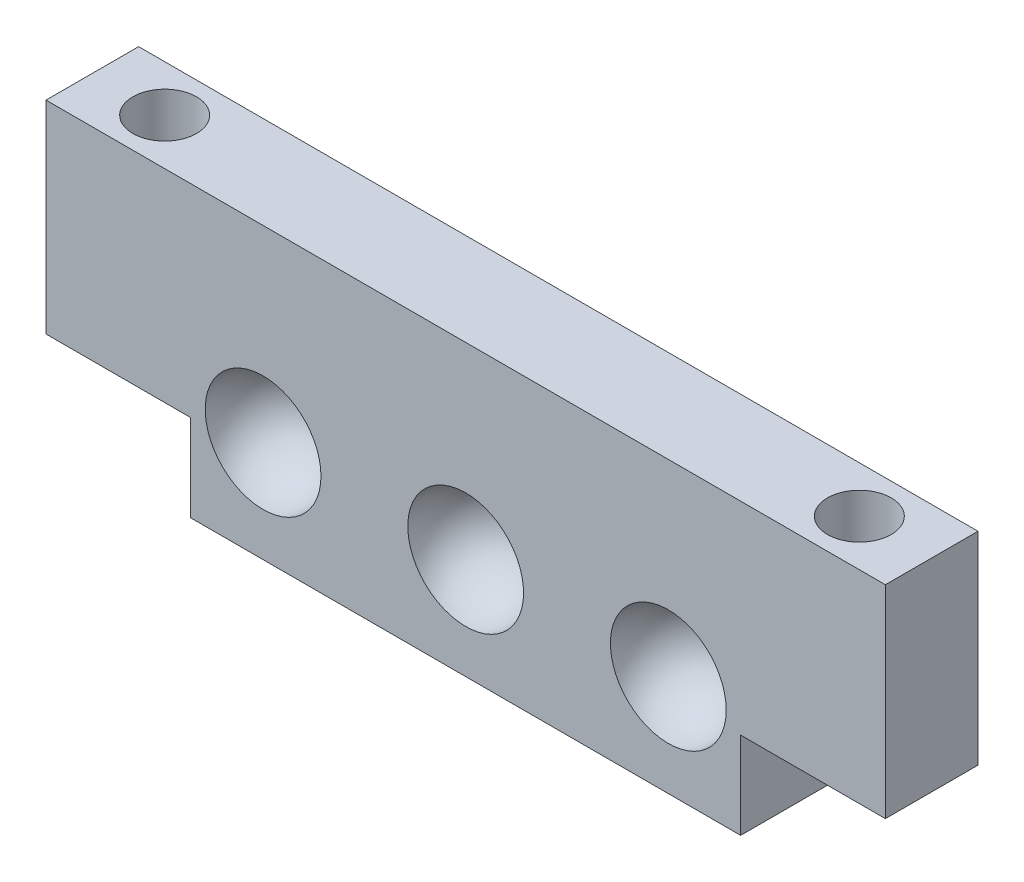
ISO-10303-21;
HEADER;
FILE_DESCRIPTION(('STEP AP214'),'2;1');
FILE_NAME('part.step','',(''),(''),'','','');
FILE_SCHEMA(('AUTOMOTIVE_DESIGN { 1 0 10303 214 1 1 1 1 }'));
ENDSEC;
DATA;
#1=APPLICATION_CONTEXT('core data for automotive mechanical design processes');
#2=APPLICATION_PROTOCOL_DEFINITION('international standard','automotive_design',2000,#1);
#3=PRODUCT_CONTEXT('',#1,'mechanical');
#4=PRODUCT('Part','Part','',(#3));
#5=PRODUCT_RELATED_PRODUCT_CATEGORY('part','',(#4));
#6=PRODUCT_DEFINITION_FORMATION('','',#4);
#7=PRODUCT_DEFINITION_CONTEXT('part definition',#1,'design');
#8=PRODUCT_DEFINITION('design','',#6,#7);
#9=PRODUCT_DEFINITION_SHAPE('','',#8);
#10=(LENGTH_UNIT() NAMED_UNIT(*) SI_UNIT(.MILLI.,.METRE.));
#11=(NAMED_UNIT(*) PLANE_ANGLE_UNIT() SI_UNIT($,.RADIAN.));
#12=(NAMED_UNIT(*) SI_UNIT($,.STERADIAN.) SOLID_ANGLE_UNIT());
#13=UNCERTAINTY_MEASURE_WITH_UNIT(LENGTH_MEASURE(1.E-05),#10,'distance_accuracy_value','');
#14=(GEOMETRIC_REPRESENTATION_CONTEXT(3) GLOBAL_UNCERTAINTY_ASSIGNED_CONTEXT((#13)) GLOBAL_UNIT_ASSIGNED_CONTEXT((#10,
#11,#12)) REPRESENTATION_CONTEXT('',''));
#15=CARTESIAN_POINT('',(0.,0.,0.));
#16=DIRECTION('',(0.,0.,1.));
#17=DIRECTION('',(1.,0.,0.));
#18=AXIS2_PLACEMENT_3D('',#15,#16,#17);
#19=CARTESIAN_POINT('',(132.5,57.7665613260769,-8.));
#20=DIRECTION('',(0.,-1.,0.));
#21=DIRECTION('',(0.,0.,-1.));
#22=AXIS2_PLACEMENT_3D('',#19,#20,#21);
#23=CYLINDRICAL_SURFACE('',#22,5.5);
#24=CARTESIAN_POINT('',(132.5,0.,-8.));
#25=DIRECTION('',(0.,1.,0.));
#26=DIRECTION('',(0.,0.,-1.));
#27=AXIS2_PLACEMENT_3D('',#24,#25,#26);
#28=CIRCLE('',#27,5.5);
#29=CARTESIAN_POINT('',(132.5,0.,-13.5));
#30=VERTEX_POINT('',#29);
#31=EDGE_CURVE('E117',#30,#30,#28,.T.);
#32=ORIENTED_EDGE('',*,*,#31,.F.);
#33=EDGE_LOOP('',(#32));
#34=FACE_BOUND('',#33,.T.);
#35=CARTESIAN_POINT('',(132.5,35.,-8.));
#36=DIRECTION('',(0.,-1.,0.));
#37=DIRECTION('',(-1.,0.,0.));
#38=AXIS2_PLACEMENT_3D('',#35,#36,#37);
#39=CIRCLE('',#38,5.5);
#40=CARTESIAN_POINT('',(127.,35.,-8.));
#41=VERTEX_POINT('',#40);
#42=EDGE_CURVE('E163',#41,#41,#39,.T.);
#43=ORIENTED_EDGE('',*,*,#42,.F.);
#44=EDGE_LOOP('',(#43));
#45=FACE_BOUND('',#44,.T.);
#46=ADVANCED_FACE('F17',(#34,#45),#23,.F.);
#47=CARTESIAN_POINT('',(12.5,57.7665613260769,-8.));
#48=DIRECTION('',(0.,-1.,0.));
#49=DIRECTION('',(0.,0.,-1.));
#50=AXIS2_PLACEMENT_3D('',#47,#48,#49);
#51=CYLINDRICAL_SURFACE('',#50,5.5);
#52=CARTESIAN_POINT('',(12.5,0.,-8.));
#53=DIRECTION('',(0.,1.,0.));
#54=DIRECTION('',(0.,0.,-1.));
#55=AXIS2_PLACEMENT_3D('',#52,#53,#54);
#56=CIRCLE('',#55,5.5);
#57=CARTESIAN_POINT('',(12.5,0.,-13.5));
#58=VERTEX_POINT('',#57);
#59=EDGE_CURVE('E178',#58,#58,#56,.T.);
#60=ORIENTED_EDGE('',*,*,#59,.F.);
#61=EDGE_LOOP('',(#60));
#62=FACE_BOUND('',#61,.T.);
#63=CARTESIAN_POINT('',(12.5,35.,-8.));
#64=DIRECTION('',(0.,-1.,0.));
#65=DIRECTION('',(-1.,0.,0.));
#66=AXIS2_PLACEMENT_3D('',#63,#64,#65);
#67=CIRCLE('',#66,5.5);
#68=CARTESIAN_POINT('',(7.,35.,-8.));
#69=VERTEX_POINT('',#68);
#70=EDGE_CURVE('E158',#69,#69,#67,.T.);
#71=ORIENTED_EDGE('',*,*,#70,.F.);
#72=EDGE_LOOP('',(#71));
#73=FACE_BOUND('',#72,.T.);
#74=ADVANCED_FACE('F281',(#62,#73),#51,.F.);
#75=CARTESIAN_POINT('',(107.5,2.5,0.));
#76=DIRECTION('',(1.,0.,0.));
#77=DIRECTION('',(0.,1.,0.));
#78=AXIS2_PLACEMENT_3D('',#75,#76,#77);
#79=SPHERICAL_SURFACE('',#78,10.);
#80=CARTESIAN_POINT('',(107.5,2.5,0.));
#81=DIRECTION('',(0.,0.,1.));
#82=DIRECTION('',(1.,0.,0.));
#83=AXIS2_PLACEMENT_3D('',#80,#81,#82);
#84=SPHERICAL_SURFACE('',#83,10.);
#85=CARTESIAN_POINT('',(107.5,2.5,0.));
#86=DIRECTION('',(0.,0.,1.));
#87=DIRECTION('',(1.,0.,0.));
#88=AXIS2_PLACEMENT_3D('',#85,#86,#87);
#89=CIRCLE('',#88,10.);
#90=CARTESIAN_POINT('',(117.5,2.5,0.));
#91=VERTEX_POINT('',#90);
#92=EDGE_CURVE('E75',#91,#91,#89,.T.);
#93=ORIENTED_EDGE('',*,*,#92,.T.);
#94=EDGE_LOOP('',(#93));
#95=FACE_BOUND('',#94,.T.);
#96=ADVANCED_FACE('F76',(#95),#84,.F.);
#97=CARTESIAN_POINT('',(72.5,2.5,0.));
#98=DIRECTION('',(1.,0.,0.));
#99=DIRECTION('',(0.,1.,0.));
#100=AXIS2_PLACEMENT_3D('',#97,#98,#99);
#101=SPHERICAL_SURFACE('',#100,10.);
#102=CARTESIAN_POINT('',(72.5,2.5,0.));
#103=DIRECTION('',(0.,0.,1.));
#104=DIRECTION('',(1.,0.,0.));
#105=AXIS2_PLACEMENT_3D('',#102,#103,#104);
#106=SPHERICAL_SURFACE('',#105,10.);
#107=CARTESIAN_POINT('',(72.5,2.5,0.));
#108=DIRECTION('',(0.,0.,1.));
#109=DIRECTION('',(1.,0.,0.));
#110=AXIS2_PLACEMENT_3D('',#107,#108,#109);
#111=CIRCLE('',#110,10.);
#112=CARTESIAN_POINT('',(82.5,2.5,0.));
#113=VERTEX_POINT('',#112);
#114=EDGE_CURVE('E26',#113,#113,#111,.T.);
#115=ORIENTED_EDGE('',*,*,#114,.T.);
#116=EDGE_LOOP('',(#115));
#117=FACE_BOUND('',#116,.T.);
#118=ADVANCED_FACE('F292',(#117),#106,.F.);
#119=CARTESIAN_POINT('',(37.5,2.5,0.));
#120=DIRECTION('',(1.,0.,0.));
#121=DIRECTION('',(0.,1.,0.));
#122=AXIS2_PLACEMENT_3D('',#119,#120,#121);
#123=SPHERICAL_SURFACE('',#122,10.);
#124=CARTESIAN_POINT('',(37.5,2.5,0.));
#125=DIRECTION('',(0.,0.,1.));
#126=DIRECTION('',(1.,0.,0.));
#127=AXIS2_PLACEMENT_3D('',#124,#125,#126);
#128=SPHERICAL_SURFACE('',#127,10.);
#129=CARTESIAN_POINT('',(37.5,2.5,0.));
#130=DIRECTION('',(0.,0.,1.));
#131=DIRECTION('',(1.,0.,0.));
#132=AXIS2_PLACEMENT_3D('',#129,#130,#131);
#133=CIRCLE('',#132,10.);
#134=CARTESIAN_POINT('',(47.5,2.5,0.));
#135=VERTEX_POINT('',#134);
#136=EDGE_CURVE('E11',#135,#135,#133,.T.);
#137=ORIENTED_EDGE('',*,*,#136,.T.);
#138=EDGE_LOOP('',(#137));
#139=FACE_BOUND('',#138,.T.);
#140=ADVANCED_FACE('F301',(#139),#128,.F.);
#141=CARTESIAN_POINT('',(0.,0.,0.));
#142=DIRECTION('',(0.,0.,1.));
#143=DIRECTION('',(1.,0.,0.));
#144=AXIS2_PLACEMENT_3D('',#141,#142,#143);
#145=PLANE('',#144);
#146=DIRECTION('',(0.,1.,0.));
#147=VECTOR('',#146,1.);
#148=CARTESIAN_POINT('',(145.,0.,0.));
#149=LINE('',#148,#147);
#150=CARTESIAN_POINT('',(145.,0.,0.));
#151=VERTEX_POINT('',#150);
#152=CARTESIAN_POINT('',(145.,35.,0.));
#153=VERTEX_POINT('',#152);
#154=EDGE_CURVE('E132',#151,#153,#149,.T.);
#155=ORIENTED_EDGE('',*,*,#154,.T.);
#156=DIRECTION('',(-1.,0.,0.));
#157=VECTOR('',#156,1.);
#158=CARTESIAN_POINT('',(145.,35.,0.));
#159=LINE('',#158,#157);
#160=CARTESIAN_POINT('',(0.,35.,0.));
#161=VERTEX_POINT('',#160);
#162=EDGE_CURVE('E162',#153,#161,#159,.T.);
#163=ORIENTED_EDGE('',*,*,#162,.T.);
#164=DIRECTION('',(0.,-1.,0.));
#165=VECTOR('',#164,1.);
#166=CARTESIAN_POINT('',(0.,35.,0.));
#167=LINE('',#166,#165);
#168=CARTESIAN_POINT('',(0.,0.,0.));
#169=VERTEX_POINT('',#168);
#170=EDGE_CURVE('E166',#161,#169,#167,.T.);
#171=ORIENTED_EDGE('',*,*,#170,.T.);
#172=DIRECTION('',(1.,0.,0.));
#173=VECTOR('',#172,1.);
#174=CARTESIAN_POINT('',(0.,0.,0.));
#175=LINE('',#174,#173);
#176=CARTESIAN_POINT('',(25.,0.,0.));
#177=VERTEX_POINT('',#176);
#178=EDGE_CURVE('E181',#169,#177,#175,.T.);
#179=ORIENTED_EDGE('',*,*,#178,.T.);
#180=DIRECTION('',(0.,-1.,0.));
#181=VECTOR('',#180,1.);
#182=CARTESIAN_POINT('',(25.,0.,0.));
#183=LINE('',#182,#181);
#184=CARTESIAN_POINT('',(25.,-15.,0.));
#185=VERTEX_POINT('',#184);
#186=EDGE_CURVE('E201',#177,#185,#183,.T.);
#187=ORIENTED_EDGE('',*,*,#186,.T.);
#188=DIRECTION('',(1.,0.,0.));
#189=VECTOR('',#188,1.);
#190=CARTESIAN_POINT('',(25.,-15.,0.));
#191=LINE('',#190,#189);
#192=CARTESIAN_POINT('',(120.,-15.,0.));
#193=VERTEX_POINT('',#192);
#194=EDGE_CURVE('E97',#185,#193,#191,.T.);
#195=ORIENTED_EDGE('',*,*,#194,.T.);
#196=DIRECTION('',(0.,1.,0.));
#197=VECTOR('',#196,1.);
#198=CARTESIAN_POINT('',(120.,-15.,0.));
#199=LINE('',#198,#197);
#200=CARTESIAN_POINT('',(120.,0.,0.));
#201=VERTEX_POINT('',#200);
#202=EDGE_CURVE('E105',#193,#201,#199,.T.);
#203=ORIENTED_EDGE('',*,*,#202,.T.);
#204=DIRECTION('',(1.,0.,0.));
#205=VECTOR('',#204,1.);
#206=CARTESIAN_POINT('',(120.,0.,0.));
#207=LINE('',#206,#205);
#208=EDGE_CURVE('E86',#201,#151,#207,.T.);
#209=ORIENTED_EDGE('',*,*,#208,.T.);
#210=EDGE_LOOP('',(#155,#163,#171,#179,#187,#195,#203,#209));
#211=FACE_BOUND('',#210,.T.);
#212=ORIENTED_EDGE('',*,*,#136,.F.);
#213=EDGE_LOOP('',(#212));
#214=FACE_BOUND('',#213,.T.);
#215=ORIENTED_EDGE('',*,*,#114,.F.);
#216=EDGE_LOOP('',(#215));
#217=FACE_BOUND('',#216,.T.);
#218=ORIENTED_EDGE('',*,*,#92,.F.);
#219=EDGE_LOOP('',(#218));
#220=FACE_BOUND('',#219,.T.);
#221=ADVANCED_FACE('F127',(#211,#214,#217,#220),#145,.T.);
#222=CARTESIAN_POINT('',(0.,0.,-16.));
#223=DIRECTION('',(0.,0.,1.));
#224=DIRECTION('',(1.,0.,0.));
#225=AXIS2_PLACEMENT_3D('',#222,#223,#224);
#226=PLANE('',#225);
#227=DIRECTION('',(0.,1.,0.));
#228=VECTOR('',#227,1.);
#229=CARTESIAN_POINT('',(145.,0.,-16.));
#230=LINE('',#229,#228);
#231=CARTESIAN_POINT('',(145.,0.,-16.));
#232=VERTEX_POINT('',#231);
#233=CARTESIAN_POINT('',(145.,35.,-16.));
#234=VERTEX_POINT('',#233);
#235=EDGE_CURVE('E148',#232,#234,#230,.T.);
#236=ORIENTED_EDGE('',*,*,#235,.F.);
#237=DIRECTION('',(1.,0.,0.));
#238=VECTOR('',#237,1.);
#239=CARTESIAN_POINT('',(120.,0.,-16.));
#240=LINE('',#239,#238);
#241=CARTESIAN_POINT('',(120.,0.,-16.));
#242=VERTEX_POINT('',#241);
#243=EDGE_CURVE('E79',#242,#232,#240,.T.);
#244=ORIENTED_EDGE('',*,*,#243,.F.);
#245=DIRECTION('',(0.,1.,0.));
#246=VECTOR('',#245,1.);
#247=CARTESIAN_POINT('',(120.,-15.,-16.));
#248=LINE('',#247,#246);
#249=CARTESIAN_POINT('',(120.,-15.,-16.));
#250=VERTEX_POINT('',#249);
#251=EDGE_CURVE('E109',#250,#242,#248,.T.);
#252=ORIENTED_EDGE('',*,*,#251,.F.);
#253=DIRECTION('',(1.,0.,0.));
#254=VECTOR('',#253,1.);
#255=CARTESIAN_POINT('',(25.,-15.,-16.));
#256=LINE('',#255,#254);
#257=CARTESIAN_POINT('',(25.,-15.,-16.));
#258=VERTEX_POINT('',#257);
#259=EDGE_CURVE('E92',#258,#250,#256,.T.);
#260=ORIENTED_EDGE('',*,*,#259,.F.);
#261=DIRECTION('',(0.,-1.,0.));
#262=VECTOR('',#261,1.);
#263=CARTESIAN_POINT('',(25.,0.,-16.));
#264=LINE('',#263,#262);
#265=CARTESIAN_POINT('',(25.,0.,-16.));
#266=VERTEX_POINT('',#265);
#267=EDGE_CURVE('E90',#266,#258,#264,.T.);
#268=ORIENTED_EDGE('',*,*,#267,.F.);
#269=DIRECTION('',(1.,0.,0.));
#270=VECTOR('',#269,1.);
#271=CARTESIAN_POINT('',(0.,0.,-16.));
#272=LINE('',#271,#270);
#273=CARTESIAN_POINT('',(0.,0.,-16.));
#274=VERTEX_POINT('',#273);
#275=EDGE_CURVE('E202',#274,#266,#272,.T.);
#276=ORIENTED_EDGE('',*,*,#275,.F.);
#277=DIRECTION('',(0.,-1.,0.));
#278=VECTOR('',#277,1.);
#279=CARTESIAN_POINT('',(0.,35.,-16.));
#280=LINE('',#279,#278);
#281=CARTESIAN_POINT('',(0.,35.,-16.));
#282=VERTEX_POINT('',#281);
#283=EDGE_CURVE('E170',#282,#274,#280,.T.);
#284=ORIENTED_EDGE('',*,*,#283,.F.);
#285=DIRECTION('',(-1.,0.,0.));
#286=VECTOR('',#285,1.);
#287=CARTESIAN_POINT('',(145.,35.,-16.));
#288=LINE('',#287,#286);
#289=EDGE_CURVE('E174',#234,#282,#288,.T.);
#290=ORIENTED_EDGE('',*,*,#289,.F.);
#291=EDGE_LOOP('',(#236,#244,#252,#260,#268,#276,#284,#290));
#292=FACE_BOUND('',#291,.T.);
#293=ADVANCED_FACE('F227',(#292),#226,.F.);
#294=CARTESIAN_POINT('',(120.,0.,-16.));
#295=DIRECTION('',(0.,-1.,0.));
#296=DIRECTION('',(0.,0.,-1.));
#297=AXIS2_PLACEMENT_3D('',#294,#295,#296);
#298=PLANE('',#297);
#299=ORIENTED_EDGE('',*,*,#208,.F.);
#300=DIRECTION('',(0.,0.,1.));
#301=VECTOR('',#300,1.);
#302=CARTESIAN_POINT('',(120.,0.,-16.));
#303=LINE('',#302,#301);
#304=EDGE_CURVE('E113',#242,#201,#303,.T.);
#305=ORIENTED_EDGE('',*,*,#304,.F.);
#306=ORIENTED_EDGE('',*,*,#243,.T.);
#307=DIRECTION('',(0.,0.,1.));
#308=VECTOR('',#307,1.);
#309=CARTESIAN_POINT('',(145.,0.,-16.));
#310=LINE('',#309,#308);
#311=EDGE_CURVE('E140',#232,#151,#310,.T.);
#312=ORIENTED_EDGE('',*,*,#311,.T.);
#313=EDGE_LOOP('',(#299,#305,#306,#312));
#314=FACE_BOUND('',#313,.T.);
#315=ORIENTED_EDGE('',*,*,#31,.T.);
#316=EDGE_LOOP('',(#315));
#317=FACE_BOUND('',#316,.T.);
#318=ADVANCED_FACE('F141',(#314,#317),#298,.T.);
#319=CARTESIAN_POINT('',(120.,-15.,-16.));
#320=DIRECTION('',(1.,0.,0.));
#321=DIRECTION('',(0.,1.,0.));
#322=AXIS2_PLACEMENT_3D('',#319,#320,#321);
#323=PLANE('',#322);
#324=ORIENTED_EDGE('',*,*,#202,.F.);
#325=DIRECTION('',(0.,0.,1.));
#326=VECTOR('',#325,1.);
#327=CARTESIAN_POINT('',(120.,-15.,-16.));
#328=LINE('',#327,#326);
#329=EDGE_CURVE('E96',#250,#193,#328,.T.);
#330=ORIENTED_EDGE('',*,*,#329,.F.);
#331=ORIENTED_EDGE('',*,*,#251,.T.);
#332=ORIENTED_EDGE('',*,*,#304,.T.);
#333=EDGE_LOOP('',(#324,#330,#331,#332));
#334=FACE_BOUND('',#333,.T.);
#335=ADVANCED_FACE('F266',(#334),#323,.T.);
#336=CARTESIAN_POINT('',(25.,-15.,-16.));
#337=DIRECTION('',(0.,-1.,0.));
#338=DIRECTION('',(0.,0.,-1.));
#339=AXIS2_PLACEMENT_3D('',#336,#337,#338);
#340=PLANE('',#339);
#341=ORIENTED_EDGE('',*,*,#194,.F.);
#342=DIRECTION('',(0.,0.,1.));
#343=VECTOR('',#342,1.);
#344=CARTESIAN_POINT('',(25.,-15.,-16.));
#345=LINE('',#344,#343);
#346=EDGE_CURVE('E98',#258,#185,#345,.T.);
#347=ORIENTED_EDGE('',*,*,#346,.F.);
#348=ORIENTED_EDGE('',*,*,#259,.T.);
#349=ORIENTED_EDGE('',*,*,#329,.T.);
#350=EDGE_LOOP('',(#341,#347,#348,#349));
#351=FACE_BOUND('',#350,.T.);
#352=ADVANCED_FACE('F268',(#351),#340,.T.);
#353=CARTESIAN_POINT('',(25.,0.,-16.));
#354=DIRECTION('',(-1.,0.,0.));
#355=DIRECTION('',(0.,1.,0.));
#356=AXIS2_PLACEMENT_3D('',#353,#354,#355);
#357=PLANE('',#356);
#358=ORIENTED_EDGE('',*,*,#186,.F.);
#359=DIRECTION('',(0.,0.,1.));
#360=VECTOR('',#359,1.);
#361=CARTESIAN_POINT('',(25.,0.,-16.));
#362=LINE('',#361,#360);
#363=EDGE_CURVE('E197',#266,#177,#362,.T.);
#364=ORIENTED_EDGE('',*,*,#363,.F.);
#365=ORIENTED_EDGE('',*,*,#267,.T.);
#366=ORIENTED_EDGE('',*,*,#346,.T.);
#367=EDGE_LOOP('',(#358,#364,#365,#366));
#368=FACE_BOUND('',#367,.T.);
#369=ADVANCED_FACE('F221',(#368),#357,.T.);
#370=CARTESIAN_POINT('',(0.,0.,-16.));
#371=DIRECTION('',(0.,-1.,0.));
#372=DIRECTION('',(0.,0.,-1.));
#373=AXIS2_PLACEMENT_3D('',#370,#371,#372);
#374=PLANE('',#373);
#375=ORIENTED_EDGE('',*,*,#178,.F.);
#376=DIRECTION('',(0.,0.,1.));
#377=VECTOR('',#376,1.);
#378=CARTESIAN_POINT('',(0.,0.,-16.));
#379=LINE('',#378,#377);
#380=EDGE_CURVE('E182',#274,#169,#379,.T.);
#381=ORIENTED_EDGE('',*,*,#380,.F.);
#382=ORIENTED_EDGE('',*,*,#275,.T.);
#383=ORIENTED_EDGE('',*,*,#363,.T.);
#384=EDGE_LOOP('',(#375,#381,#382,#383));
#385=FACE_BOUND('',#384,.T.);
#386=ORIENTED_EDGE('',*,*,#59,.T.);
#387=EDGE_LOOP('',(#386));
#388=FACE_BOUND('',#387,.T.);
#389=ADVANCED_FACE('F355',(#385,#388),#374,.T.);
#390=CARTESIAN_POINT('',(0.,35.,-16.));
#391=DIRECTION('',(-1.,0.,0.));
#392=DIRECTION('',(0.,0.,1.));
#393=AXIS2_PLACEMENT_3D('',#390,#391,#392);
#394=PLANE('',#393);
#395=ORIENTED_EDGE('',*,*,#170,.F.);
#396=DIRECTION('',(0.,0.,1.));
#397=VECTOR('',#396,1.);
#398=CARTESIAN_POINT('',(0.,35.,-16.));
#399=LINE('',#398,#397);
#400=EDGE_CURVE('E171',#282,#161,#399,.T.);
#401=ORIENTED_EDGE('',*,*,#400,.F.);
#402=ORIENTED_EDGE('',*,*,#283,.T.);
#403=ORIENTED_EDGE('',*,*,#380,.T.);
#404=EDGE_LOOP('',(#395,#401,#402,#403));
#405=FACE_BOUND('',#404,.T.);
#406=ADVANCED_FACE('F260',(#405),#394,.T.);
#407=CARTESIAN_POINT('',(145.,35.,-16.));
#408=DIRECTION('',(0.,1.,0.));
#409=DIRECTION('',(1.,0.,0.));
#410=AXIS2_PLACEMENT_3D('',#407,#408,#409);
#411=PLANE('',#410);
#412=ORIENTED_EDGE('',*,*,#162,.F.);
#413=DIRECTION('',(0.,0.,1.));
#414=VECTOR('',#413,1.);
#415=CARTESIAN_POINT('',(145.,35.,-16.));
#416=LINE('',#415,#414);
#417=EDGE_CURVE('E153',#234,#153,#416,.T.);
#418=ORIENTED_EDGE('',*,*,#417,.F.);
#419=ORIENTED_EDGE('',*,*,#289,.T.);
#420=ORIENTED_EDGE('',*,*,#400,.T.);
#421=EDGE_LOOP('',(#412,#418,#419,#420));
#422=FACE_BOUND('',#421,.T.);
#423=ORIENTED_EDGE('',*,*,#70,.T.);
#424=EDGE_LOOP('',(#423));
#425=FACE_BOUND('',#424,.T.);
#426=ORIENTED_EDGE('',*,*,#42,.T.);
#427=EDGE_LOOP('',(#426));
#428=FACE_BOUND('',#427,.T.);
#429=ADVANCED_FACE('F262',(#422,#425,#428),#411,.T.);
#430=CARTESIAN_POINT('',(145.,0.,-16.));
#431=DIRECTION('',(1.,0.,0.));
#432=DIRECTION('',(0.,1.,0.));
#433=AXIS2_PLACEMENT_3D('',#430,#431,#432);
#434=PLANE('',#433);
#435=ORIENTED_EDGE('',*,*,#154,.F.);
#436=ORIENTED_EDGE('',*,*,#311,.F.);
#437=ORIENTED_EDGE('',*,*,#235,.T.);
#438=ORIENTED_EDGE('',*,*,#417,.T.);
#439=EDGE_LOOP('',(#435,#436,#437,#438));
#440=FACE_BOUND('',#439,.T.);
#441=ADVANCED_FACE('F151',(#440),#434,.T.);
#442=CLOSED_SHELL('',(#46,#74,#96,#118,#140,#221,#293,#318,#335,#352,#369,#389,#406,#429,#441));
#443=MANIFOLD_SOLID_BREP('B1',#442);
#444=ADVANCED_BREP_SHAPE_REPRESENTATION('',(#18,#443),#14);
#445=SHAPE_DEFINITION_REPRESENTATION(#9,#444);
ENDSEC;
END-ISO-10303-21;
